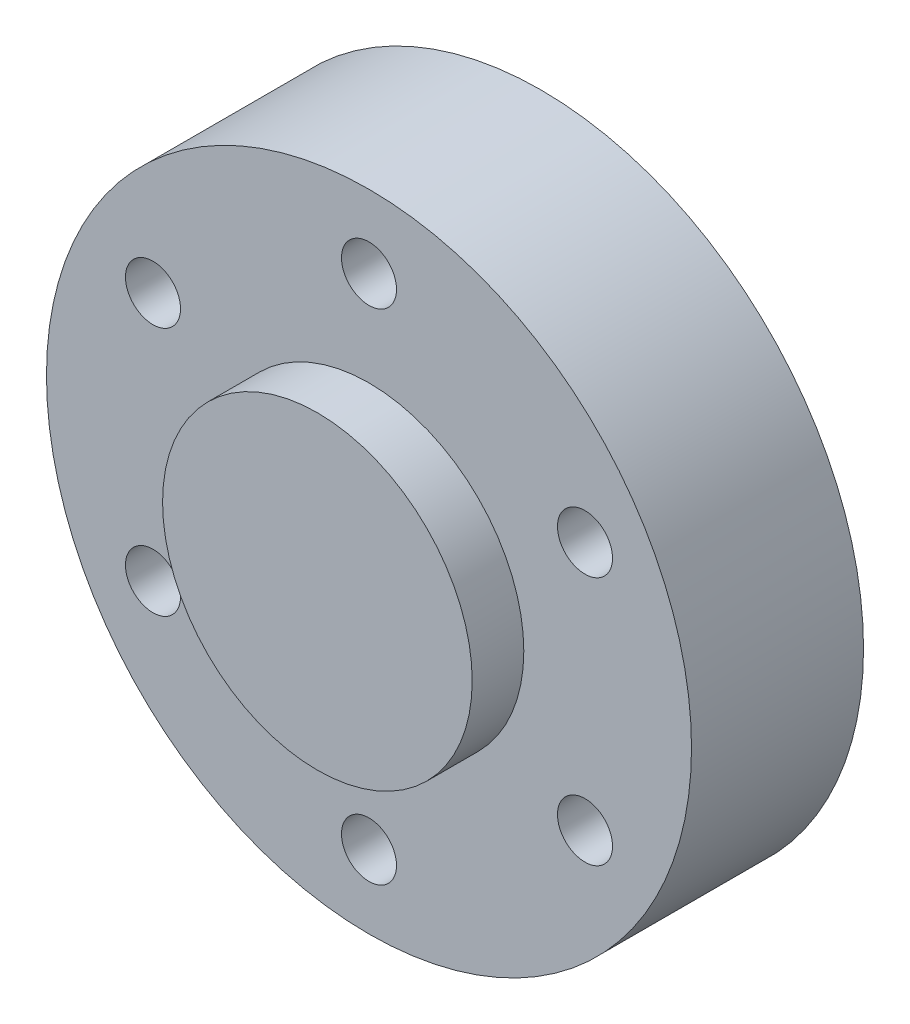
ISO-10303-21;
HEADER;
FILE_DESCRIPTION(('STEP AP214'),'2;1');
FILE_NAME('part.step','',(''),(''),'','','');
FILE_SCHEMA(('AUTOMOTIVE_DESIGN { 1 0 10303 214 1 1 1 1 }'));
ENDSEC;
DATA;
#1=APPLICATION_CONTEXT('core data for automotive mechanical design processes');
#2=APPLICATION_PROTOCOL_DEFINITION('international standard','automotive_design',2000,#1);
#3=PRODUCT_CONTEXT('',#1,'mechanical');
#4=PRODUCT('Part','Part','',(#3));
#5=PRODUCT_RELATED_PRODUCT_CATEGORY('part','',(#4));
#6=PRODUCT_DEFINITION_FORMATION('','',#4);
#7=PRODUCT_DEFINITION_CONTEXT('part definition',#1,'design');
#8=PRODUCT_DEFINITION('design','',#6,#7);
#9=PRODUCT_DEFINITION_SHAPE('','',#8);
#10=(LENGTH_UNIT() NAMED_UNIT(*) SI_UNIT(.MILLI.,.METRE.));
#11=(NAMED_UNIT(*) PLANE_ANGLE_UNIT() SI_UNIT($,.RADIAN.));
#12=(NAMED_UNIT(*) SI_UNIT($,.STERADIAN.) SOLID_ANGLE_UNIT());
#13=UNCERTAINTY_MEASURE_WITH_UNIT(LENGTH_MEASURE(1.E-05),#10,'distance_accuracy_value','');
#14=(GEOMETRIC_REPRESENTATION_CONTEXT(3) GLOBAL_UNCERTAINTY_ASSIGNED_CONTEXT((#13)) GLOBAL_UNIT_ASSIGNED_CONTEXT((#10,
#11,#12)) REPRESENTATION_CONTEXT('',''));
#15=CARTESIAN_POINT('',(0.,0.,0.));
#16=DIRECTION('',(0.,0.,1.));
#17=DIRECTION('',(1.,0.,0.));
#18=AXIS2_PLACEMENT_3D('',#15,#16,#17);
#19=CARTESIAN_POINT('',(0.,14.5,10.));
#20=DIRECTION('',(0.,0.,-1.));
#21=DIRECTION('',(-1.,0.,0.));
#22=AXIS2_PLACEMENT_3D('',#19,#20,#21);
#23=CYLINDRICAL_SURFACE('',#22,1.6);
#24=CARTESIAN_POINT('',(0.,14.5,10.));
#25=DIRECTION('',(0.,0.,1.));
#26=DIRECTION('',(1.,0.,0.));
#27=AXIS2_PLACEMENT_3D('',#24,#25,#26);
#28=CIRCLE('',#27,1.6);
#29=CARTESIAN_POINT('',(1.6,14.5,10.));
#30=VERTEX_POINT('',#29);
#31=EDGE_CURVE('E103',#30,#30,#28,.T.);
#32=ORIENTED_EDGE('',*,*,#31,.T.);
#33=EDGE_LOOP('',(#32));
#34=FACE_BOUND('',#33,.T.);
#35=CARTESIAN_POINT('',(0.,14.5,0.));
#36=DIRECTION('',(0.,0.,1.));
#37=DIRECTION('',(1.,0.,0.));
#38=AXIS2_PLACEMENT_3D('',#35,#36,#37);
#39=CIRCLE('',#38,1.6);
#40=CARTESIAN_POINT('',(1.6,14.5,0.));
#41=VERTEX_POINT('',#40);
#42=EDGE_CURVE('E75',#41,#41,#39,.T.);
#43=ORIENTED_EDGE('',*,*,#42,.F.);
#44=EDGE_LOOP('',(#43));
#45=FACE_BOUND('',#44,.T.);
#46=ADVANCED_FACE('F45',(#34,#45),#23,.F.);
#47=CARTESIAN_POINT('',(12.5573683548744,7.24999999999997,10.));
#48=DIRECTION('',(0.,0.,-1.));
#49=DIRECTION('',(-1.,0.,0.));
#50=AXIS2_PLACEMENT_3D('',#47,#48,#49);
#51=CYLINDRICAL_SURFACE('',#50,1.6);
#52=CARTESIAN_POINT('',(12.5573683548744,7.24999999999997,10.));
#53=DIRECTION('',(0.,0.,1.));
#54=DIRECTION('',(1.,0.,0.));
#55=AXIS2_PLACEMENT_3D('',#52,#53,#54);
#56=CIRCLE('',#55,1.6);
#57=CARTESIAN_POINT('',(14.1573683548744,7.24999999999997,10.));
#58=VERTEX_POINT('',#57);
#59=EDGE_CURVE('E107',#58,#58,#56,.T.);
#60=ORIENTED_EDGE('',*,*,#59,.T.);
#61=EDGE_LOOP('',(#60));
#62=FACE_BOUND('',#61,.T.);
#63=CARTESIAN_POINT('',(12.5573683548744,7.24999999999997,0.));
#64=DIRECTION('',(0.,0.,1.));
#65=DIRECTION('',(1.,0.,0.));
#66=AXIS2_PLACEMENT_3D('',#63,#64,#65);
#67=CIRCLE('',#66,1.6);
#68=CARTESIAN_POINT('',(14.1573683548744,7.24999999999997,0.));
#69=VERTEX_POINT('',#68);
#70=EDGE_CURVE('E79',#69,#69,#67,.T.);
#71=ORIENTED_EDGE('',*,*,#70,.F.);
#72=EDGE_LOOP('',(#71));
#73=FACE_BOUND('',#72,.T.);
#74=ADVANCED_FACE('F166',(#62,#73),#51,.F.);
#75=CARTESIAN_POINT('',(12.5573683548743,-7.25000000000006,10.));
#76=DIRECTION('',(0.,0.,-1.));
#77=DIRECTION('',(-1.,0.,0.));
#78=AXIS2_PLACEMENT_3D('',#75,#76,#77);
#79=CYLINDRICAL_SURFACE('',#78,1.6);
#80=CARTESIAN_POINT('',(12.5573683548743,-7.25000000000006,10.));
#81=DIRECTION('',(0.,0.,1.));
#82=DIRECTION('',(1.,0.,0.));
#83=AXIS2_PLACEMENT_3D('',#80,#81,#82);
#84=CIRCLE('',#83,1.6);
#85=CARTESIAN_POINT('',(14.1573683548743,-7.25000000000006,10.));
#86=VERTEX_POINT('',#85);
#87=EDGE_CURVE('E111',#86,#86,#84,.T.);
#88=ORIENTED_EDGE('',*,*,#87,.T.);
#89=EDGE_LOOP('',(#88));
#90=FACE_BOUND('',#89,.T.);
#91=CARTESIAN_POINT('',(12.5573683548743,-7.25000000000006,0.));
#92=DIRECTION('',(0.,0.,1.));
#93=DIRECTION('',(1.,0.,0.));
#94=AXIS2_PLACEMENT_3D('',#91,#92,#93);
#95=CIRCLE('',#94,1.6);
#96=CARTESIAN_POINT('',(14.1573683548743,-7.25000000000006,0.));
#97=VERTEX_POINT('',#96);
#98=EDGE_CURVE('E83',#97,#97,#95,.T.);
#99=ORIENTED_EDGE('',*,*,#98,.F.);
#100=EDGE_LOOP('',(#99));
#101=FACE_BOUND('',#100,.T.);
#102=ADVANCED_FACE('F172',(#90,#101),#79,.F.);
#103=CARTESIAN_POINT('',(-1.01252958826451E-13,-14.5,10.));
#104=DIRECTION('',(0.,0.,-1.));
#105=DIRECTION('',(-1.,0.,0.));
#106=AXIS2_PLACEMENT_3D('',#103,#104,#105);
#107=CYLINDRICAL_SURFACE('',#106,1.6);
#108=CARTESIAN_POINT('',(-1.01252958826451E-13,-14.5,10.));
#109=DIRECTION('',(0.,0.,1.));
#110=DIRECTION('',(1.,0.,0.));
#111=AXIS2_PLACEMENT_3D('',#108,#109,#110);
#112=CIRCLE('',#111,1.6);
#113=CARTESIAN_POINT('',(1.5999999999999,-14.5,10.));
#114=VERTEX_POINT('',#113);
#115=EDGE_CURVE('E115',#114,#114,#112,.T.);
#116=ORIENTED_EDGE('',*,*,#115,.T.);
#117=EDGE_LOOP('',(#116));
#118=FACE_BOUND('',#117,.T.);
#119=CARTESIAN_POINT('',(-1.01252958826451E-13,-14.5,0.));
#120=DIRECTION('',(0.,0.,1.));
#121=DIRECTION('',(1.,0.,0.));
#122=AXIS2_PLACEMENT_3D('',#119,#120,#121);
#123=CIRCLE('',#122,1.6);
#124=CARTESIAN_POINT('',(1.5999999999999,-14.5,0.));
#125=VERTEX_POINT('',#124);
#126=EDGE_CURVE('E87',#125,#125,#123,.T.);
#127=ORIENTED_EDGE('',*,*,#126,.F.);
#128=EDGE_LOOP('',(#127));
#129=FACE_BOUND('',#128,.T.);
#130=ADVANCED_FACE('F182',(#118,#129),#107,.F.);
#131=CARTESIAN_POINT('',(-12.5573683548744,-7.24999999999988,10.));
#132=DIRECTION('',(0.,0.,-1.));
#133=DIRECTION('',(-1.,0.,0.));
#134=AXIS2_PLACEMENT_3D('',#131,#132,#133);
#135=CYLINDRICAL_SURFACE('',#134,1.6);
#136=CARTESIAN_POINT('',(-12.5573683548744,-7.24999999999988,10.));
#137=DIRECTION('',(0.,0.,1.));
#138=DIRECTION('',(1.,0.,0.));
#139=AXIS2_PLACEMENT_3D('',#136,#137,#138);
#140=CIRCLE('',#139,1.6);
#141=CARTESIAN_POINT('',(-10.9573683548744,-7.24999999999988,10.));
#142=VERTEX_POINT('',#141);
#143=EDGE_CURVE('E119',#142,#142,#140,.T.);
#144=ORIENTED_EDGE('',*,*,#143,.T.);
#145=EDGE_LOOP('',(#144));
#146=FACE_BOUND('',#145,.T.);
#147=CARTESIAN_POINT('',(-12.5573683548744,-7.24999999999988,0.));
#148=DIRECTION('',(0.,0.,1.));
#149=DIRECTION('',(1.,0.,0.));
#150=AXIS2_PLACEMENT_3D('',#147,#148,#149);
#151=CIRCLE('',#150,1.6);
#152=CARTESIAN_POINT('',(-10.9573683548744,-7.24999999999988,0.));
#153=VERTEX_POINT('',#152);
#154=EDGE_CURVE('E91',#153,#153,#151,.T.);
#155=ORIENTED_EDGE('',*,*,#154,.F.);
#156=EDGE_LOOP('',(#155));
#157=FACE_BOUND('',#156,.T.);
#158=ADVANCED_FACE('F186',(#146,#157),#135,.F.);
#159=CARTESIAN_POINT('',(-12.5573683548743,7.25000000000015,10.));
#160=DIRECTION('',(0.,0.,-1.));
#161=DIRECTION('',(-1.,0.,0.));
#162=AXIS2_PLACEMENT_3D('',#159,#160,#161);
#163=CYLINDRICAL_SURFACE('',#162,1.6);
#164=CARTESIAN_POINT('',(-12.5573683548743,7.25000000000015,10.));
#165=DIRECTION('',(0.,0.,1.));
#166=DIRECTION('',(1.,0.,0.));
#167=AXIS2_PLACEMENT_3D('',#164,#165,#166);
#168=CIRCLE('',#167,1.6);
#169=CARTESIAN_POINT('',(-10.9573683548743,7.25000000000015,10.));
#170=VERTEX_POINT('',#169);
#171=EDGE_CURVE('E74',#170,#170,#168,.T.);
#172=ORIENTED_EDGE('',*,*,#171,.T.);
#173=EDGE_LOOP('',(#172));
#174=FACE_BOUND('',#173,.T.);
#175=CARTESIAN_POINT('',(-12.5573683548743,7.25000000000015,0.));
#176=DIRECTION('',(0.,0.,1.));
#177=DIRECTION('',(1.,0.,0.));
#178=AXIS2_PLACEMENT_3D('',#175,#176,#177);
#179=CIRCLE('',#178,1.6);
#180=CARTESIAN_POINT('',(-10.9573683548743,7.25000000000015,0.));
#181=VERTEX_POINT('',#180);
#182=EDGE_CURVE('E95',#181,#181,#179,.T.);
#183=ORIENTED_EDGE('',*,*,#182,.F.);
#184=EDGE_LOOP('',(#183));
#185=FACE_BOUND('',#184,.T.);
#186=ADVANCED_FACE('F189',(#174,#185),#163,.F.);
#187=CARTESIAN_POINT('',(0.,0.,10.));
#188=DIRECTION('',(0.,0.,-1.));
#189=DIRECTION('',(-1.,0.,0.));
#190=AXIS2_PLACEMENT_3D('',#187,#188,#189);
#191=CYLINDRICAL_SURFACE('',#190,18.75);
#192=CARTESIAN_POINT('',(0.,0.,10.));
#193=DIRECTION('',(0.,0.,1.));
#194=DIRECTION('',(1.,0.,0.));
#195=AXIS2_PLACEMENT_3D('',#192,#193,#194);
#196=CIRCLE('',#195,18.75);
#197=CARTESIAN_POINT('',(18.75,0.,10.));
#198=VERTEX_POINT('',#197);
#199=EDGE_CURVE('E69',#198,#198,#196,.T.);
#200=ORIENTED_EDGE('',*,*,#199,.F.);
#201=EDGE_LOOP('',(#200));
#202=FACE_BOUND('',#201,.T.);
#203=CARTESIAN_POINT('',(0.,0.,0.));
#204=DIRECTION('',(0.,0.,1.));
#205=DIRECTION('',(1.,0.,0.));
#206=AXIS2_PLACEMENT_3D('',#203,#204,#205);
#207=CIRCLE('',#206,18.75);
#208=CARTESIAN_POINT('',(18.75,0.,0.));
#209=VERTEX_POINT('',#208);
#210=EDGE_CURVE('E70',#209,#209,#207,.T.);
#211=ORIENTED_EDGE('',*,*,#210,.T.);
#212=EDGE_LOOP('',(#211));
#213=FACE_BOUND('',#212,.T.);
#214=ADVANCED_FACE('F177',(#202,#213),#191,.T.);
#215=CARTESIAN_POINT('',(0.,0.,10.));
#216=DIRECTION('',(0.,0.,1.));
#217=DIRECTION('',(1.,0.,0.));
#218=AXIS2_PLACEMENT_3D('',#215,#216,#217);
#219=PLANE('',#218);
#220=CARTESIAN_POINT('',(0.,0.,10.));
#221=DIRECTION('',(0.,0.,1.));
#222=DIRECTION('',(1.,0.,0.));
#223=AXIS2_PLACEMENT_3D('',#220,#221,#222);
#224=CIRCLE('',#223,9.);
#225=CARTESIAN_POINT('',(9.,0.,10.));
#226=VERTEX_POINT('',#225);
#227=EDGE_CURVE('E126',#226,#226,#224,.T.);
#228=ORIENTED_EDGE('',*,*,#227,.F.);
#229=EDGE_LOOP('',(#228));
#230=FACE_BOUND('',#229,.T.);
#231=ORIENTED_EDGE('',*,*,#171,.F.);
#232=EDGE_LOOP('',(#231));
#233=FACE_BOUND('',#232,.T.);
#234=ORIENTED_EDGE('',*,*,#143,.F.);
#235=EDGE_LOOP('',(#234));
#236=FACE_BOUND('',#235,.T.);
#237=ORIENTED_EDGE('',*,*,#115,.F.);
#238=EDGE_LOOP('',(#237));
#239=FACE_BOUND('',#238,.T.);
#240=ORIENTED_EDGE('',*,*,#87,.F.);
#241=EDGE_LOOP('',(#240));
#242=FACE_BOUND('',#241,.T.);
#243=ORIENTED_EDGE('',*,*,#59,.F.);
#244=EDGE_LOOP('',(#243));
#245=FACE_BOUND('',#244,.T.);
#246=ORIENTED_EDGE('',*,*,#31,.F.);
#247=EDGE_LOOP('',(#246));
#248=FACE_BOUND('',#247,.T.);
#249=ORIENTED_EDGE('',*,*,#199,.T.);
#250=EDGE_LOOP('',(#249));
#251=FACE_BOUND('',#250,.T.);
#252=ADVANCED_FACE('F196',(#230,#233,#236,#239,#242,#245,#248,#251),#219,.T.);
#253=CARTESIAN_POINT('',(0.,0.,0.));
#254=DIRECTION('',(0.,0.,1.));
#255=DIRECTION('',(1.,0.,0.));
#256=AXIS2_PLACEMENT_3D('',#253,#254,#255);
#257=PLANE('',#256);
#258=CARTESIAN_POINT('',(0.,0.,0.));
#259=DIRECTION('',(0.,0.,1.));
#260=DIRECTION('',(1.,0.,0.));
#261=AXIS2_PLACEMENT_3D('',#258,#259,#260);
#262=CIRCLE('',#261,9.);
#263=CARTESIAN_POINT('',(9.,0.,0.));
#264=VERTEX_POINT('',#263);
#265=EDGE_CURVE('E63',#264,#264,#262,.F.);
#266=ORIENTED_EDGE('',*,*,#265,.F.);
#267=EDGE_LOOP('',(#266));
#268=FACE_BOUND('',#267,.T.);
#269=ORIENTED_EDGE('',*,*,#182,.T.);
#270=EDGE_LOOP('',(#269));
#271=FACE_BOUND('',#270,.T.);
#272=ORIENTED_EDGE('',*,*,#154,.T.);
#273=EDGE_LOOP('',(#272));
#274=FACE_BOUND('',#273,.T.);
#275=ORIENTED_EDGE('',*,*,#126,.T.);
#276=EDGE_LOOP('',(#275));
#277=FACE_BOUND('',#276,.T.);
#278=ORIENTED_EDGE('',*,*,#98,.T.);
#279=EDGE_LOOP('',(#278));
#280=FACE_BOUND('',#279,.T.);
#281=ORIENTED_EDGE('',*,*,#70,.T.);
#282=EDGE_LOOP('',(#281));
#283=FACE_BOUND('',#282,.T.);
#284=ORIENTED_EDGE('',*,*,#42,.T.);
#285=EDGE_LOOP('',(#284));
#286=FACE_BOUND('',#285,.T.);
#287=ORIENTED_EDGE('',*,*,#210,.F.);
#288=EDGE_LOOP('',(#287));
#289=FACE_BOUND('',#288,.T.);
#290=ADVANCED_FACE('F202',(#268,#271,#274,#277,#280,#283,#286,#289),#257,.F.);
#291=CARTESIAN_POINT('',(0.,0.,13.));
#292=DIRECTION('',(0.,0.,-1.));
#293=DIRECTION('',(-1.,0.,0.));
#294=AXIS2_PLACEMENT_3D('',#291,#292,#293);
#295=CYLINDRICAL_SURFACE('',#294,9.);
#296=CARTESIAN_POINT('',(0.,0.,13.));
#297=DIRECTION('',(0.,0.,1.));
#298=DIRECTION('',(1.,0.,0.));
#299=AXIS2_PLACEMENT_3D('',#296,#297,#298);
#300=CIRCLE('',#299,9.);
#301=CARTESIAN_POINT('',(9.,0.,13.));
#302=VERTEX_POINT('',#301);
#303=EDGE_CURVE('E99',#302,#302,#300,.T.);
#304=ORIENTED_EDGE('',*,*,#303,.F.);
#305=EDGE_LOOP('',(#304));
#306=FACE_BOUND('',#305,.T.);
#307=ORIENTED_EDGE('',*,*,#227,.T.);
#308=EDGE_LOOP('',(#307));
#309=FACE_BOUND('',#308,.T.);
#310=ADVANCED_FACE('F205',(#306,#309),#295,.T.);
#311=CARTESIAN_POINT('',(0.,0.,13.));
#312=DIRECTION('',(0.,0.,1.));
#313=DIRECTION('',(1.,0.,0.));
#314=AXIS2_PLACEMENT_3D('',#311,#312,#313);
#315=PLANE('',#314);
#316=ORIENTED_EDGE('',*,*,#303,.T.);
#317=EDGE_LOOP('',(#316));
#318=FACE_BOUND('',#317,.T.);
#319=ADVANCED_FACE('F228',(#318),#315,.T.);
#320=CARTESIAN_POINT('',(0.,0.,-3.));
#321=DIRECTION('',(0.,0.,1.));
#322=DIRECTION('',(1.,0.,0.));
#323=AXIS2_PLACEMENT_3D('',#320,#321,#322);
#324=CYLINDRICAL_SURFACE('',#323,9.);
#325=CARTESIAN_POINT('',(0.,0.,-3.));
#326=DIRECTION('',(0.,0.,-1.));
#327=DIRECTION('',(-1.,0.,0.));
#328=AXIS2_PLACEMENT_3D('',#325,#326,#327);
#329=CIRCLE('',#328,9.);
#330=CARTESIAN_POINT('',(-9.,0.,-3.));
#331=VERTEX_POINT('',#330);
#332=EDGE_CURVE('E130',#331,#331,#329,.T.);
#333=ORIENTED_EDGE('',*,*,#332,.F.);
#334=EDGE_LOOP('',(#333));
#335=FACE_BOUND('',#334,.T.);
#336=ORIENTED_EDGE('',*,*,#265,.T.);
#337=EDGE_LOOP('',(#336));
#338=FACE_BOUND('',#337,.T.);
#339=ADVANCED_FACE('F237',(#335,#338),#324,.T.);
#340=CARTESIAN_POINT('',(0.,0.,-3.));
#341=DIRECTION('',(0.,0.,-1.));
#342=DIRECTION('',(-1.,0.,0.));
#343=AXIS2_PLACEMENT_3D('',#340,#341,#342);
#344=PLANE('',#343);
#345=CARTESIAN_POINT('',(0.,0.,-3.));
#346=DIRECTION('',(0.,0.,-1.));
#347=DIRECTION('',(-1.,0.,0.));
#348=AXIS2_PLACEMENT_3D('',#345,#346,#347);
#349=CIRCLE('',#348,1.6);
#350=CARTESIAN_POINT('',(-1.6,0.,-3.));
#351=VERTEX_POINT('',#350);
#352=EDGE_CURVE('E58',#351,#351,#349,.T.);
#353=ORIENTED_EDGE('',*,*,#352,.F.);
#354=EDGE_LOOP('',(#353));
#355=FACE_BOUND('',#354,.T.);
#356=ORIENTED_EDGE('',*,*,#332,.T.);
#357=EDGE_LOOP('',(#356));
#358=FACE_BOUND('',#357,.T.);
#359=ADVANCED_FACE('F163',(#355,#358),#344,.T.);
#360=CARTESIAN_POINT('',(0.,0.,-4.));
#361=DIRECTION('',(0.,0.,1.));
#362=DIRECTION('',(1.,0.,0.));
#363=AXIS2_PLACEMENT_3D('',#360,#361,#362);
#364=CYLINDRICAL_SURFACE('',#363,1.6);
#365=CARTESIAN_POINT('',(0.,0.,-3.95));
#366=DIRECTION('',(0.,0.,-1.));
#367=DIRECTION('',(-1.,0.,0.));
#368=AXIS2_PLACEMENT_3D('',#365,#366,#367);
#369=CIRCLE('',#368,1.6);
#370=CARTESIAN_POINT('',(-1.6,0.,-3.95));
#371=VERTEX_POINT('',#370);
#372=EDGE_CURVE('E10',#371,#371,#369,.F.);
#373=ORIENTED_EDGE('',*,*,#372,.T.);
#374=EDGE_LOOP('',(#373));
#375=FACE_BOUND('',#374,.T.);
#376=ORIENTED_EDGE('',*,*,#352,.T.);
#377=EDGE_LOOP('',(#376));
#378=FACE_BOUND('',#377,.T.);
#379=ADVANCED_FACE('F156',(#375,#378),#364,.T.);
#380=CARTESIAN_POINT('',(0.,0.,-4.));
#381=DIRECTION('',(0.,0.,-1.));
#382=DIRECTION('',(-1.,0.,0.));
#383=AXIS2_PLACEMENT_3D('',#380,#381,#382);
#384=PLANE('',#383);
#385=CARTESIAN_POINT('',(0.,0.,-4.));
#386=DIRECTION('',(0.,0.,-1.));
#387=DIRECTION('',(-1.,0.,0.));
#388=AXIS2_PLACEMENT_3D('',#385,#386,#387);
#389=CIRCLE('',#388,1.4);
#390=CARTESIAN_POINT('',(-1.4,0.,-4.));
#391=VERTEX_POINT('',#390);
#392=EDGE_CURVE('E138',#391,#391,#389,.T.);
#393=ORIENTED_EDGE('',*,*,#392,.F.);
#394=EDGE_LOOP('',(#393));
#395=FACE_BOUND('',#394,.T.);
#396=CARTESIAN_POINT('',(0.,0.,-4.));
#397=DIRECTION('',(0.,0.,-1.));
#398=DIRECTION('',(-1.,0.,0.));
#399=AXIS2_PLACEMENT_3D('',#396,#397,#398);
#400=CIRCLE('',#399,1.55);
#401=CARTESIAN_POINT('',(-1.55,0.,-4.));
#402=VERTEX_POINT('',#401);
#403=EDGE_CURVE('E53',#402,#402,#400,.T.);
#404=ORIENTED_EDGE('',*,*,#403,.T.);
#405=EDGE_LOOP('',(#404));
#406=FACE_BOUND('',#405,.T.);
#407=ADVANCED_FACE('F154',(#395,#406),#384,.T.);
#408=CARTESIAN_POINT('',(0.,0.,-3.95));
#409=DIRECTION('',(0.,0.,-1.));
#410=DIRECTION('',(-1.,0.,0.));
#411=AXIS2_PLACEMENT_3D('',#408,#409,#410);
#412=TOROIDAL_SURFACE('',#411,1.55,0.05);
#413=ORIENTED_EDGE('',*,*,#372,.F.);
#414=EDGE_LOOP('',(#413));
#415=FACE_BOUND('',#414,.T.);
#416=ORIENTED_EDGE('',*,*,#403,.F.);
#417=EDGE_LOOP('',(#416));
#418=FACE_BOUND('',#417,.T.);
#419=ADVANCED_FACE('F47',(#415,#418),#412,.T.);
#420=CARTESIAN_POINT('',(0.,0.,6.));
#421=DIRECTION('',(0.,0.,-1.));
#422=DIRECTION('',(-1.,0.,0.));
#423=AXIS2_PLACEMENT_3D('',#420,#421,#422);
#424=CYLINDRICAL_SURFACE('',#423,1.4);
#425=CARTESIAN_POINT('',(0.,0.,6.));
#426=DIRECTION('',(0.,0.,-1.));
#427=DIRECTION('',(-1.,0.,0.));
#428=AXIS2_PLACEMENT_3D('',#425,#426,#427);
#429=CIRCLE('',#428,1.4);
#430=CARTESIAN_POINT('',(-1.4,0.,6.));
#431=VERTEX_POINT('',#430);
#432=EDGE_CURVE('E136',#431,#431,#429,.T.);
#433=ORIENTED_EDGE('',*,*,#432,.F.);
#434=EDGE_LOOP('',(#433));
#435=FACE_BOUND('',#434,.T.);
#436=ORIENTED_EDGE('',*,*,#392,.T.);
#437=EDGE_LOOP('',(#436));
#438=FACE_BOUND('',#437,.T.);
#439=ADVANCED_FACE('F148',(#435,#438),#424,.F.);
#440=CARTESIAN_POINT('',(0.,0.,6.));
#441=DIRECTION('',(0.,0.,-1.));
#442=DIRECTION('',(-1.,0.,0.));
#443=AXIS2_PLACEMENT_3D('',#440,#441,#442);
#444=PLANE('',#443);
#445=ORIENTED_EDGE('',*,*,#432,.T.);
#446=EDGE_LOOP('',(#445));
#447=FACE_BOUND('',#446,.T.);
#448=ADVANCED_FACE('F146',(#447),#444,.T.);
#449=CLOSED_SHELL('',(#46,#74,#102,#130,#158,#186,#214,#252,#290,#310,#319,#339,#359,#379,#407,
#419,#439,#448));
#450=MANIFOLD_SOLID_BREP('B2',#449);
#451=ADVANCED_BREP_SHAPE_REPRESENTATION('',(#18,#450),#14);
#452=SHAPE_DEFINITION_REPRESENTATION(#9,#451);
ENDSEC;
END-ISO-10303-21;
